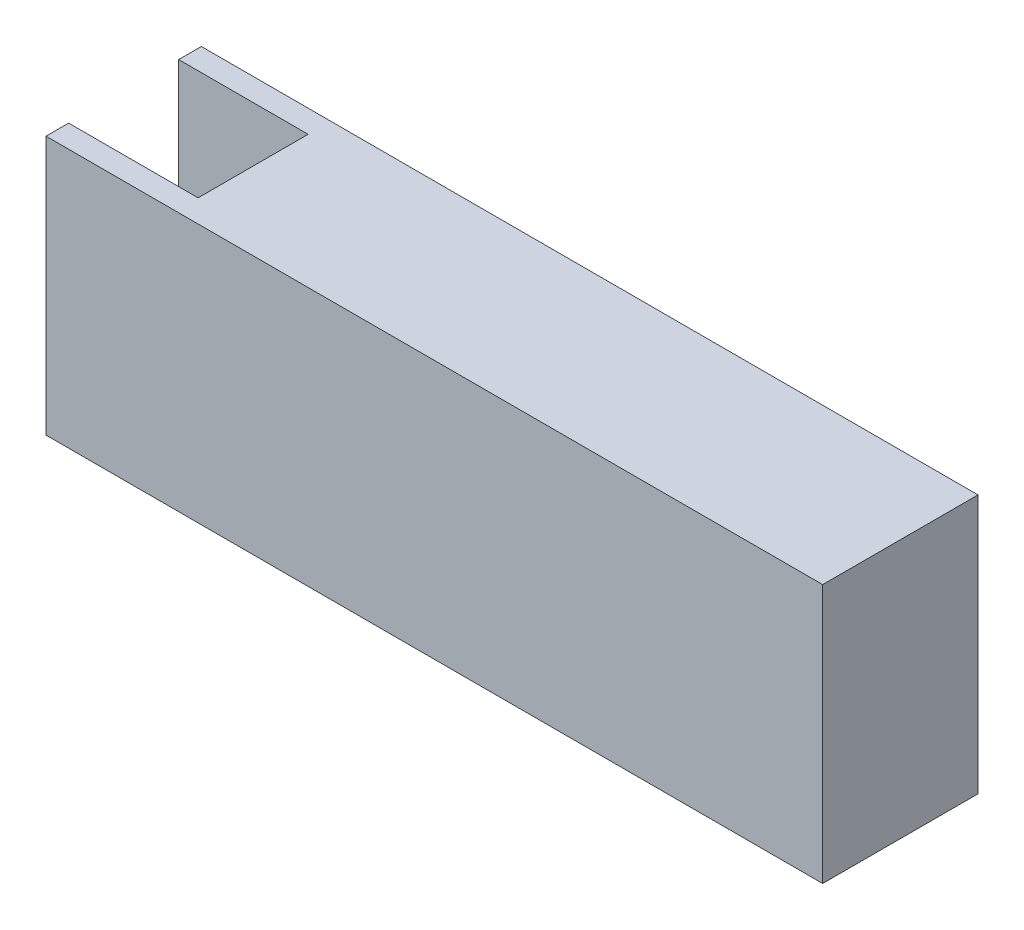
ISO-10303-21;
HEADER;
FILE_DESCRIPTION(('STEP AP214'),'2;1');
FILE_NAME('part.step','',(''),(''),'','','');
FILE_SCHEMA(('AUTOMOTIVE_DESIGN { 1 0 10303 214 1 1 1 1 }'));
ENDSEC;
DATA;
#1=APPLICATION_CONTEXT('core data for automotive mechanical design processes');
#2=APPLICATION_PROTOCOL_DEFINITION('international standard','automotive_design',2000,#1);
#3=PRODUCT_CONTEXT('',#1,'mechanical');
#4=PRODUCT('Part','Part','',(#3));
#5=PRODUCT_RELATED_PRODUCT_CATEGORY('part','',(#4));
#6=PRODUCT_DEFINITION_FORMATION('','',#4);
#7=PRODUCT_DEFINITION_CONTEXT('part definition',#1,'design');
#8=PRODUCT_DEFINITION('design','',#6,#7);
#9=PRODUCT_DEFINITION_SHAPE('','',#8);
#10=(LENGTH_UNIT() NAMED_UNIT(*) SI_UNIT(.MILLI.,.METRE.));
#11=(NAMED_UNIT(*) PLANE_ANGLE_UNIT() SI_UNIT($,.RADIAN.));
#12=(NAMED_UNIT(*) SI_UNIT($,.STERADIAN.) SOLID_ANGLE_UNIT());
#13=UNCERTAINTY_MEASURE_WITH_UNIT(LENGTH_MEASURE(1.E-05),#10,'distance_accuracy_value','');
#14=(GEOMETRIC_REPRESENTATION_CONTEXT(3) GLOBAL_UNCERTAINTY_ASSIGNED_CONTEXT((#13)) GLOBAL_UNIT_ASSIGNED_CONTEXT((#10,
#11,#12)) REPRESENTATION_CONTEXT('',''));
#15=CARTESIAN_POINT('',(0.,0.,0.));
#16=DIRECTION('',(0.,0.,1.));
#17=DIRECTION('',(1.,0.,0.));
#18=AXIS2_PLACEMENT_3D('',#15,#16,#17);
#19=CARTESIAN_POINT('',(-1.,10.,0.));
#20=DIRECTION('',(-1.,0.,0.));
#21=DIRECTION('',(0.,0.,1.));
#22=AXIS2_PLACEMENT_3D('',#19,#20,#21);
#23=PLANE('',#22);
#24=DIRECTION('',(0.,0.,-1.));
#25=VECTOR('',#24,1.);
#26=CARTESIAN_POINT('',(-1.,0.,0.));
#27=LINE('',#26,#25);
#28=CARTESIAN_POINT('',(-1.,0.,-2.125));
#29=VERTEX_POINT('',#28);
#30=CARTESIAN_POINT('',(-1.,0.,-3.));
#31=VERTEX_POINT('',#30);
#32=EDGE_CURVE('E159',#29,#31,#27,.T.);
#33=ORIENTED_EDGE('',*,*,#32,.F.);
#34=DIRECTION('',(0.,-1.,0.));
#35=VECTOR('',#34,1.);
#36=CARTESIAN_POINT('',(-1.,10.,-2.125));
#37=LINE('',#36,#35);
#38=CARTESIAN_POINT('',(-1.,10.,-2.125));
#39=VERTEX_POINT('',#38);
#40=EDGE_CURVE('E117',#39,#29,#37,.T.);
#41=ORIENTED_EDGE('',*,*,#40,.F.);
#42=DIRECTION('',(0.,0.,-1.));
#43=VECTOR('',#42,1.);
#44=CARTESIAN_POINT('',(-1.,10.,0.));
#45=LINE('',#44,#43);
#46=CARTESIAN_POINT('',(-1.,10.,-3.));
#47=VERTEX_POINT('',#46);
#48=EDGE_CURVE('E130',#39,#47,#45,.T.);
#49=ORIENTED_EDGE('',*,*,#48,.T.);
#50=DIRECTION('',(0.,-1.,0.));
#51=VECTOR('',#50,1.);
#52=CARTESIAN_POINT('',(-1.,10.,-3.));
#53=LINE('',#52,#51);
#54=EDGE_CURVE('E47',#47,#31,#53,.T.);
#55=ORIENTED_EDGE('',*,*,#54,.T.);
#56=EDGE_LOOP('',(#33,#41,#49,#55));
#57=FACE_BOUND('',#56,.T.);
#58=ADVANCED_FACE('F39',(#57),#23,.T.);
#59=CARTESIAN_POINT('',(-1.,10.,3.));
#60=VERTEX_POINT('',#59);
#61=CARTESIAN_POINT('',(-1.,10.,2.125));
#62=VERTEX_POINT('',#61);
#63=EDGE_CURVE('E150',#60,#62,#45,.T.);
#64=ORIENTED_EDGE('',*,*,#63,.T.);
#65=DIRECTION('',(0.,-1.,0.));
#66=VECTOR('',#65,1.);
#67=CARTESIAN_POINT('',(-1.,10.,2.125));
#68=LINE('',#67,#66);
#69=CARTESIAN_POINT('',(-1.,0.,2.125));
#70=VERTEX_POINT('',#69);
#71=EDGE_CURVE('E140',#62,#70,#68,.T.);
#72=ORIENTED_EDGE('',*,*,#71,.T.);
#73=CARTESIAN_POINT('',(-1.,0.,3.));
#74=VERTEX_POINT('',#73);
#75=EDGE_CURVE('E160',#74,#70,#27,.T.);
#76=ORIENTED_EDGE('',*,*,#75,.F.);
#77=DIRECTION('',(0.,-1.,0.));
#78=VECTOR('',#77,1.);
#79=CARTESIAN_POINT('',(-1.,10.,3.));
#80=LINE('',#79,#78);
#81=EDGE_CURVE('E166',#60,#74,#80,.T.);
#82=ORIENTED_EDGE('',*,*,#81,.F.);
#83=EDGE_LOOP('',(#64,#72,#76,#82));
#84=FACE_BOUND('',#83,.T.);
#85=ADVANCED_FACE('F180',(#84),#23,.T.);
#86=CARTESIAN_POINT('',(0.,10.,0.));
#87=DIRECTION('',(0.,1.,0.));
#88=DIRECTION('',(0.,0.,1.));
#89=AXIS2_PLACEMENT_3D('',#86,#87,#88);
#90=PLANE('',#89);
#91=ORIENTED_EDGE('',*,*,#48,.F.);
#92=DIRECTION('',(-1.,0.,0.));
#93=VECTOR('',#92,1.);
#94=CARTESIAN_POINT('',(0.,10.,-2.125));
#95=LINE('',#94,#93);
#96=CARTESIAN_POINT('',(4.,10.,-2.125));
#97=VERTEX_POINT('',#96);
#98=EDGE_CURVE('E112',#97,#39,#95,.T.);
#99=ORIENTED_EDGE('',*,*,#98,.F.);
#100=DIRECTION('',(0.,0.,1.));
#101=VECTOR('',#100,1.);
#102=CARTESIAN_POINT('',(4.,10.,0.));
#103=LINE('',#102,#101);
#104=CARTESIAN_POINT('',(4.,10.,2.125));
#105=VERTEX_POINT('',#104);
#106=EDGE_CURVE('E120',#97,#105,#103,.T.);
#107=ORIENTED_EDGE('',*,*,#106,.T.);
#108=DIRECTION('',(1.,0.,0.));
#109=VECTOR('',#108,1.);
#110=CARTESIAN_POINT('',(0.,10.,2.125));
#111=LINE('',#110,#109);
#112=EDGE_CURVE('E131',#62,#105,#111,.T.);
#113=ORIENTED_EDGE('',*,*,#112,.F.);
#114=ORIENTED_EDGE('',*,*,#63,.F.);
#115=DIRECTION('',(-1.,0.,0.));
#116=VECTOR('',#115,1.);
#117=CARTESIAN_POINT('',(0.,10.,3.));
#118=LINE('',#117,#116);
#119=CARTESIAN_POINT('',(29.,10.,3.));
#120=VERTEX_POINT('',#119);
#121=EDGE_CURVE('E153',#120,#60,#118,.T.);
#122=ORIENTED_EDGE('',*,*,#121,.F.);
#123=DIRECTION('',(0.,0.,1.));
#124=VECTOR('',#123,1.);
#125=CARTESIAN_POINT('',(29.,10.,0.));
#126=LINE('',#125,#124);
#127=CARTESIAN_POINT('',(29.,10.,-3.));
#128=VERTEX_POINT('',#127);
#129=EDGE_CURVE('E144',#128,#120,#126,.T.);
#130=ORIENTED_EDGE('',*,*,#129,.F.);
#131=DIRECTION('',(1.,0.,0.));
#132=VECTOR('',#131,1.);
#133=CARTESIAN_POINT('',(0.,10.,-3.));
#134=LINE('',#133,#132);
#135=EDGE_CURVE('E146',#47,#128,#134,.T.);
#136=ORIENTED_EDGE('',*,*,#135,.F.);
#137=EDGE_LOOP('',(#91,#99,#107,#113,#114,#122,#130,#136));
#138=FACE_BOUND('',#137,.T.);
#139=ADVANCED_FACE('F128',(#138),#90,.T.);
#140=CARTESIAN_POINT('',(0.,0.,0.));
#141=DIRECTION('',(0.,1.,0.));
#142=DIRECTION('',(0.,0.,1.));
#143=AXIS2_PLACEMENT_3D('',#140,#141,#142);
#144=PLANE('',#143);
#145=DIRECTION('',(-1.,0.,0.));
#146=VECTOR('',#145,1.);
#147=CARTESIAN_POINT('',(0.,0.,-2.125));
#148=LINE('',#147,#146);
#149=CARTESIAN_POINT('',(4.,0.,-2.125));
#150=VERTEX_POINT('',#149);
#151=EDGE_CURVE('E115',#150,#29,#148,.T.);
#152=ORIENTED_EDGE('',*,*,#151,.T.);
#153=ORIENTED_EDGE('',*,*,#32,.T.);
#154=DIRECTION('',(1.,0.,0.));
#155=VECTOR('',#154,1.);
#156=CARTESIAN_POINT('',(0.,0.,-3.));
#157=LINE('',#156,#155);
#158=CARTESIAN_POINT('',(29.,0.,-3.));
#159=VERTEX_POINT('',#158);
#160=EDGE_CURVE('E156',#31,#159,#157,.T.);
#161=ORIENTED_EDGE('',*,*,#160,.T.);
#162=DIRECTION('',(0.,0.,1.));
#163=VECTOR('',#162,1.);
#164=CARTESIAN_POINT('',(29.,0.,0.));
#165=LINE('',#164,#163);
#166=CARTESIAN_POINT('',(29.,0.,3.));
#167=VERTEX_POINT('',#166);
#168=EDGE_CURVE('E116',#159,#167,#165,.T.);
#169=ORIENTED_EDGE('',*,*,#168,.T.);
#170=DIRECTION('',(-1.,0.,0.));
#171=VECTOR('',#170,1.);
#172=CARTESIAN_POINT('',(0.,0.,3.));
#173=LINE('',#172,#171);
#174=EDGE_CURVE('E147',#167,#74,#173,.T.);
#175=ORIENTED_EDGE('',*,*,#174,.T.);
#176=ORIENTED_EDGE('',*,*,#75,.T.);
#177=DIRECTION('',(1.,0.,0.));
#178=VECTOR('',#177,1.);
#179=CARTESIAN_POINT('',(0.,0.,2.125));
#180=LINE('',#179,#178);
#181=CARTESIAN_POINT('',(4.,0.,2.125));
#182=VERTEX_POINT('',#181);
#183=EDGE_CURVE('E125',#70,#182,#180,.T.);
#184=ORIENTED_EDGE('',*,*,#183,.T.);
#185=DIRECTION('',(0.,0.,1.));
#186=VECTOR('',#185,1.);
#187=CARTESIAN_POINT('',(4.,0.,0.));
#188=LINE('',#187,#186);
#189=EDGE_CURVE('E54',#150,#182,#188,.T.);
#190=ORIENTED_EDGE('',*,*,#189,.F.);
#191=EDGE_LOOP('',(#152,#153,#161,#169,#175,#176,#184,#190));
#192=FACE_BOUND('',#191,.T.);
#193=ADVANCED_FACE('F175',(#192),#144,.F.);
#194=CARTESIAN_POINT('',(29.,10.,0.));
#195=DIRECTION('',(1.,0.,0.));
#196=DIRECTION('',(0.,0.,-1.));
#197=AXIS2_PLACEMENT_3D('',#194,#195,#196);
#198=PLANE('',#197);
#199=ORIENTED_EDGE('',*,*,#168,.F.);
#200=DIRECTION('',(0.,-1.,0.));
#201=VECTOR('',#200,1.);
#202=CARTESIAN_POINT('',(29.,10.,-3.));
#203=LINE('',#202,#201);
#204=EDGE_CURVE('E11',#128,#159,#203,.T.);
#205=ORIENTED_EDGE('',*,*,#204,.F.);
#206=ORIENTED_EDGE('',*,*,#129,.T.);
#207=DIRECTION('',(0.,-1.,0.));
#208=VECTOR('',#207,1.);
#209=CARTESIAN_POINT('',(29.,10.,3.));
#210=LINE('',#209,#208);
#211=EDGE_CURVE('E63',#120,#167,#210,.T.);
#212=ORIENTED_EDGE('',*,*,#211,.T.);
#213=EDGE_LOOP('',(#199,#205,#206,#212));
#214=FACE_BOUND('',#213,.T.);
#215=ADVANCED_FACE('F41',(#214),#198,.T.);
#216=CARTESIAN_POINT('',(0.,10.,-3.));
#217=DIRECTION('',(0.,0.,-1.));
#218=DIRECTION('',(-1.,0.,0.));
#219=AXIS2_PLACEMENT_3D('',#216,#217,#218);
#220=PLANE('',#219);
#221=ORIENTED_EDGE('',*,*,#160,.F.);
#222=ORIENTED_EDGE('',*,*,#54,.F.);
#223=ORIENTED_EDGE('',*,*,#135,.T.);
#224=ORIENTED_EDGE('',*,*,#204,.T.);
#225=EDGE_LOOP('',(#221,#222,#223,#224));
#226=FACE_BOUND('',#225,.T.);
#227=ADVANCED_FACE('F173',(#226),#220,.T.);
#228=CARTESIAN_POINT('',(0.,10.,3.));
#229=DIRECTION('',(0.,0.,1.));
#230=DIRECTION('',(1.,0.,0.));
#231=AXIS2_PLACEMENT_3D('',#228,#229,#230);
#232=PLANE('',#231);
#233=ORIENTED_EDGE('',*,*,#174,.F.);
#234=ORIENTED_EDGE('',*,*,#211,.F.);
#235=ORIENTED_EDGE('',*,*,#121,.T.);
#236=ORIENTED_EDGE('',*,*,#81,.T.);
#237=EDGE_LOOP('',(#233,#234,#235,#236));
#238=FACE_BOUND('',#237,.T.);
#239=ADVANCED_FACE('F183',(#238),#232,.T.);
#240=CARTESIAN_POINT('',(4.,10.,0.));
#241=DIRECTION('',(1.,0.,0.));
#242=DIRECTION('',(0.,0.,-1.));
#243=AXIS2_PLACEMENT_3D('',#240,#241,#242);
#244=PLANE('',#243);
#245=ORIENTED_EDGE('',*,*,#189,.T.);
#246=DIRECTION('',(0.,-1.,0.));
#247=VECTOR('',#246,1.);
#248=CARTESIAN_POINT('',(4.,10.,2.125));
#249=LINE('',#248,#247);
#250=EDGE_CURVE('E122',#105,#182,#249,.T.);
#251=ORIENTED_EDGE('',*,*,#250,.F.);
#252=ORIENTED_EDGE('',*,*,#106,.F.);
#253=DIRECTION('',(0.,-1.,0.));
#254=VECTOR('',#253,1.);
#255=CARTESIAN_POINT('',(4.,10.,-2.125));
#256=LINE('',#255,#254);
#257=EDGE_CURVE('E108',#97,#150,#256,.T.);
#258=ORIENTED_EDGE('',*,*,#257,.T.);
#259=EDGE_LOOP('',(#245,#251,#252,#258));
#260=FACE_BOUND('',#259,.T.);
#261=ADVANCED_FACE('F121',(#260),#244,.F.);
#262=CARTESIAN_POINT('',(0.,10.,-2.125));
#263=DIRECTION('',(0.,0.,1.));
#264=DIRECTION('',(1.,0.,0.));
#265=AXIS2_PLACEMENT_3D('',#262,#263,#264);
#266=PLANE('',#265);
#267=ORIENTED_EDGE('',*,*,#151,.F.);
#268=ORIENTED_EDGE('',*,*,#257,.F.);
#269=ORIENTED_EDGE('',*,*,#98,.T.);
#270=ORIENTED_EDGE('',*,*,#40,.T.);
#271=EDGE_LOOP('',(#267,#268,#269,#270));
#272=FACE_BOUND('',#271,.T.);
#273=ADVANCED_FACE('F110',(#272),#266,.T.);
#274=CARTESIAN_POINT('',(0.,10.,2.125));
#275=DIRECTION('',(0.,0.,-1.));
#276=DIRECTION('',(-1.,0.,0.));
#277=AXIS2_PLACEMENT_3D('',#274,#275,#276);
#278=PLANE('',#277);
#279=ORIENTED_EDGE('',*,*,#183,.F.);
#280=ORIENTED_EDGE('',*,*,#71,.F.);
#281=ORIENTED_EDGE('',*,*,#112,.T.);
#282=ORIENTED_EDGE('',*,*,#250,.T.);
#283=EDGE_LOOP('',(#279,#280,#281,#282));
#284=FACE_BOUND('',#283,.T.);
#285=ADVANCED_FACE('F178',(#284),#278,.T.);
#286=CLOSED_SHELL('',(#58,#85,#139,#193,#215,#227,#239,#261,#273,#285));
#287=MANIFOLD_SOLID_BREP('B2',#286);
#288=ADVANCED_BREP_SHAPE_REPRESENTATION('',(#18,#287),#14);
#289=SHAPE_DEFINITION_REPRESENTATION(#9,#288);
ENDSEC;
END-ISO-10303-21;
